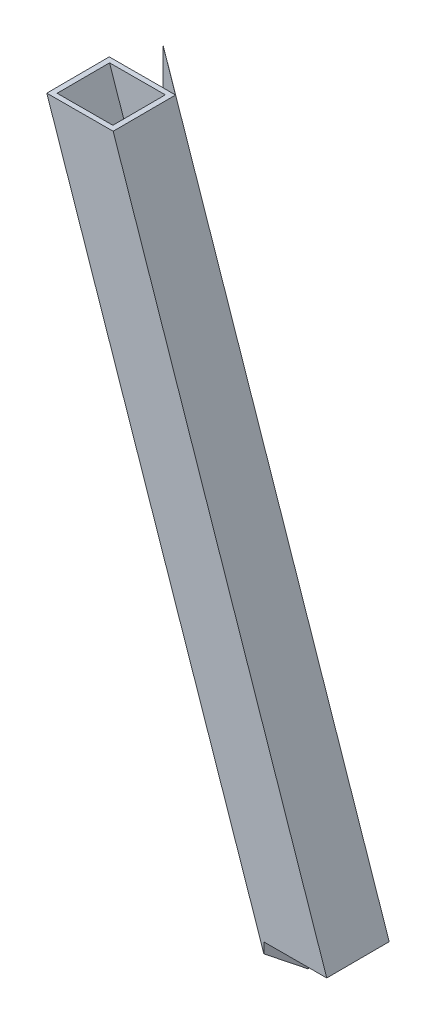
ISO-10303-21;
HEADER;
FILE_DESCRIPTION(('STEP AP214'),'2;1');
FILE_NAME('part.step','',(''),(''),'','','');
FILE_SCHEMA(('AUTOMOTIVE_DESIGN { 1 0 10303 214 1 1 1 1 }'));
ENDSEC;
DATA;
#1=APPLICATION_CONTEXT('core data for automotive mechanical design processes');
#2=APPLICATION_PROTOCOL_DEFINITION('international standard','automotive_design',2000,#1);
#3=PRODUCT_CONTEXT('',#1,'mechanical');
#4=PRODUCT('Part','Part','',(#3));
#5=PRODUCT_RELATED_PRODUCT_CATEGORY('part','',(#4));
#6=PRODUCT_DEFINITION_FORMATION('','',#4);
#7=PRODUCT_DEFINITION_CONTEXT('part definition',#1,'design');
#8=PRODUCT_DEFINITION('design','',#6,#7);
#9=PRODUCT_DEFINITION_SHAPE('','',#8);
#10=(LENGTH_UNIT() NAMED_UNIT(*) SI_UNIT(.MILLI.,.METRE.));
#11=(NAMED_UNIT(*) PLANE_ANGLE_UNIT() SI_UNIT($,.RADIAN.));
#12=(NAMED_UNIT(*) SI_UNIT($,.STERADIAN.) SOLID_ANGLE_UNIT());
#13=UNCERTAINTY_MEASURE_WITH_UNIT(LENGTH_MEASURE(1.E-05),#10,'distance_accuracy_value','');
#14=(GEOMETRIC_REPRESENTATION_CONTEXT(3) GLOBAL_UNCERTAINTY_ASSIGNED_CONTEXT((#13)) GLOBAL_UNIT_ASSIGNED_CONTEXT((#10,
#11,#12)) REPRESENTATION_CONTEXT('',''));
#15=CARTESIAN_POINT('',(0.,0.,0.));
#16=DIRECTION('',(0.,0.,1.));
#17=DIRECTION('',(1.,0.,0.));
#18=AXIS2_PLACEMENT_3D('',#15,#16,#17);
#19=CARTESIAN_POINT('',(-242.073675816652,222.702155971596,-2008.42565950212));
#20=DIRECTION('',(0.00289573675775497,0.000987182985598285,0.99999532007824));
#21=DIRECTION('',(0.99999580734144,0.,-0.00289573816874753));
#22=AXIS2_PLACEMENT_3D('',#19,#20,#21);
#23=PLANE('',#22);
#24=DIRECTION('',(0.000246975568326585,0.999999481525949,-0.00098790227330634));
#25=VECTOR('',#24,1.);
#26=CARTESIAN_POINT('',(-183.158702057765,222.687436880048,-2008.59624802512));
#27=LINE('',#26,#25);
#28=CARTESIAN_POINT('',(-183.212525642923,4.75674188591024,-2008.38095368449));
#29=VERTEX_POINT('',#28);
#30=CARTESIAN_POINT('',(-183.211230685599,10.,-2008.38613351378));
#31=VERTEX_POINT('',#30);
#32=EDGE_CURVE('E264',#29,#31,#27,.T.);
#33=ORIENTED_EDGE('',*,*,#32,.T.);
#34=DIRECTION('',(0.99999580734144,0.,-0.00289573816874753));
#35=VECTOR('',#34,1.);
#36=CARTESIAN_POINT('',(-242.073067780984,10.,-2008.21568433079));
#37=LINE('',#36,#35);
#38=CARTESIAN_POINT('',(-169.561577189971,10.,-2008.42565950212));
#39=VERTEX_POINT('',#38);
#40=EDGE_CURVE('E213',#31,#39,#37,.T.);
#41=ORIENTED_EDGE('',*,*,#40,.T.);
#42=DIRECTION('',(0.322673927788139,-0.94651018817854,0.));
#43=VECTOR('',#42,1.);
#44=CARTESIAN_POINT('',(-242.073675816652,222.702155971596,-2008.42565950212));
#45=LINE('',#44,#43);
#46=CARTESIAN_POINT('',(-237.743395371789,210.,-2008.42565950212));
#47=VERTEX_POINT('',#46);
#48=EDGE_CURVE('E227',#47,#39,#45,.T.);
#49=ORIENTED_EDGE('',*,*,#48,.F.);
#50=DIRECTION('',(-0.99999580734144,0.,0.00289573816874753));
#51=VECTOR('',#50,1.);
#52=CARTESIAN_POINT('',(-242.073639505953,210.,-2008.41312019633));
#53=LINE('',#52,#51);
#54=CARTESIAN_POINT('',(-255.492725053658,210.,-2008.3742618752));
#55=VERTEX_POINT('',#54);
#56=EDGE_CURVE('E194',#47,#55,#53,.T.);
#57=ORIENTED_EDGE('',*,*,#56,.T.);
#58=DIRECTION('',(0.322673927788139,-0.94651018817854,0.));
#59=VECTOR('',#58,1.);
#60=CARTESIAN_POINT('',(-257.974972560878,217.281259354246,-2008.3742618752));
#61=LINE('',#60,#59);
#62=CARTESIAN_POINT('',(-184.999999999999,3.22133984233382,-2008.3742618752));
#63=VERTEX_POINT('',#62);
#64=EDGE_CURVE('E191',#55,#63,#61,.T.);
#65=ORIENTED_EDGE('',*,*,#64,.T.);
#66=DIRECTION('',(0.,0.999999512730672,-0.0009871871245328));
#67=VECTOR('',#66,1.);
#68=CARTESIAN_POINT('',(-184.999999999999,222.701992818159,-2008.59093045547));
#69=LINE('',#68,#67);
#70=CARTESIAN_POINT('',(-184.999999999999,10.,-2008.38095368449));
#71=VERTEX_POINT('',#70);
#72=EDGE_CURVE('E210',#63,#71,#69,.T.);
#73=ORIENTED_EDGE('',*,*,#72,.T.);
#74=DIRECTION('',(-0.322673927788139,0.94651018817854,0.));
#75=VECTOR('',#74,1.);
#76=CARTESIAN_POINT('',(2133.78786446609,-6791.7777357672,-2008.38095368449));
#77=LINE('',#76,#75);
#78=EDGE_CURVE('E260',#29,#71,#77,.T.);
#79=ORIENTED_EDGE('',*,*,#78,.F.);
#80=EDGE_LOOP('',(#33,#41,#49,#57,#65,#73,#79));
#81=FACE_BOUND('',#80,.T.);
#82=ADVANCED_FACE('F41',(#81),#23,.T.);
#83=CARTESIAN_POINT('',(-240.563899781729,223.216852347138,-2010.03054702633));
#84=DIRECTION('',(0.00289573675775387,0.000987182985597912,0.99999532007824));
#85=DIRECTION('',(0.99999580734144,0.,-0.00289573816874643));
#86=AXIS2_PLACEMENT_3D('',#83,#84,#85);
#87=PLANE('',#86);
#88=DIRECTION('',(-0.322673927788139,0.94651018817854,0.));
#89=VECTOR('',#88,1.);
#90=CARTESIAN_POINT('',(2133.78786446609,-6791.7777357672,-2009.9809611724));
#91=LINE('',#90,#89);
#92=CARTESIAN_POINT('',(-182.812523770946,3.58340306144367,-2009.9809611724));
#93=VERTEX_POINT('',#92);
#94=CARTESIAN_POINT('',(-184.999999999999,10.,-2009.9809611724));
#95=VERTEX_POINT('',#94);
#96=EDGE_CURVE('E49',#93,#95,#91,.T.);
#97=ORIENTED_EDGE('',*,*,#96,.T.);
#98=DIRECTION('',(0.,0.999999512730672,-0.000987187124532427));
#99=VECTOR('',#98,1.);
#100=CARTESIAN_POINT('',(-184.999999999999,223.216693509617,-2010.19144604953));
#101=LINE('',#100,#99);
#102=CARTESIAN_POINT('',(-184.999999999999,-1.75237320357124,-2009.96935937523));
#103=VERTEX_POINT('',#102);
#104=EDGE_CURVE('E57',#103,#95,#101,.T.);
#105=ORIENTED_EDGE('',*,*,#104,.F.);
#106=DIRECTION('',(0.322673927788139,-0.94651018817854,0.));
#107=VECTOR('',#106,1.);
#108=CARTESIAN_POINT('',(-259.494014953427,216.76340399315,-2009.96935937523));
#109=LINE('',#108,#107);
#110=CARTESIAN_POINT('',(-257.188309046844,210.,-2009.96935937523));
#111=VERTEX_POINT('',#110);
#112=EDGE_CURVE('E185',#111,#103,#109,.T.);
#113=ORIENTED_EDGE('',*,*,#112,.F.);
#114=DIRECTION('',(-0.99999580734144,0.,0.00289573816874643));
#115=VECTOR('',#114,1.);
#116=CARTESIAN_POINT('',(-240.563861999706,210.,-2010.01749962292));
#117=LINE('',#116,#115);
#118=CARTESIAN_POINT('',(-240.,210.,-2010.01913242648));
#119=VERTEX_POINT('',#118);
#120=EDGE_CURVE('E168',#119,#111,#117,.T.);
#121=ORIENTED_EDGE('',*,*,#120,.F.);
#122=DIRECTION('',(0.,-0.999999512730672,0.000987187124532427));
#123=VECTOR('',#122,1.);
#124=CARTESIAN_POINT('',(-240.,223.216850735148,-2010.03217993771));
#125=LINE('',#124,#123);
#126=CARTESIAN_POINT('',(-240.,221.562746320733,-2010.03054702633));
#127=VERTEX_POINT('',#126);
#128=EDGE_CURVE('E215',#127,#119,#125,.T.);
#129=ORIENTED_EDGE('',*,*,#128,.F.);
#130=DIRECTION('',(0.322673927788139,-0.94651018817854,0.));
#131=VECTOR('',#130,1.);
#132=CARTESIAN_POINT('',(-240.563899781729,223.216852347138,-2010.03054702633));
#133=LINE('',#132,#131);
#134=CARTESIAN_POINT('',(-167.876336481568,10.,-2010.03054702633));
#135=VERTEX_POINT('',#134);
#136=EDGE_CURVE('E193',#127,#135,#133,.T.);
#137=ORIENTED_EDGE('',*,*,#136,.T.);
#138=DIRECTION('',(0.99999580734144,0.,-0.00289573816874643));
#139=VECTOR('',#138,1.);
#140=CARTESIAN_POINT('',(-240.563290274738,10.,-2009.82006375738));
#141=LINE('',#140,#139);
#142=CARTESIAN_POINT('',(-182.810939027448,10.,-2009.98730014638));
#143=VERTEX_POINT('',#142);
#144=EDGE_CURVE('E232',#143,#135,#141,.T.);
#145=ORIENTED_EDGE('',*,*,#144,.F.);
#146=DIRECTION('',(0.000246975568326492,0.999999481525949,-0.000987902273305966));
#147=VECTOR('',#146,1.);
#148=CARTESIAN_POINT('',(-182.758283213667,223.202410413144,-2010.19792340151));
#149=LINE('',#148,#147);
#150=EDGE_CURVE('E266',#93,#143,#149,.T.);
#151=ORIENTED_EDGE('',*,*,#150,.F.);
#152=EDGE_LOOP('',(#97,#105,#113,#121,#129,#137,#145,#151));
#153=FACE_BOUND('',#152,.T.);
#154=ADVANCED_FACE('F273',(#153),#87,.F.);
#155=CARTESIAN_POINT('',(-184.701425001453,-10.,-2002.42535625036));
#156=DIRECTION('',(0.970142500145332,0.,0.242535625036333));
#157=DIRECTION('',(0.242535625036333,0.,-0.970142500145332));
#158=AXIS2_PLACEMENT_3D('',#155,#156,#157);
#159=PLANE('',#158);
#160=ORIENTED_EDGE('',*,*,#150,.T.);
#161=DIRECTION('',(-0.242535625036333,0.,0.970142500145332));
#162=VECTOR('',#161,1.);
#163=CARTESIAN_POINT('',(-184.701425001453,10.,-2002.42535625036));
#164=LINE('',#163,#162);
#165=EDGE_CURVE('E11',#143,#31,#164,.T.);
#166=ORIENTED_EDGE('',*,*,#165,.T.);
#167=ORIENTED_EDGE('',*,*,#32,.F.);
#168=DIRECTION('',(0.197625199539794,-0.579700585316731,-0.790500798159178));
#169=VECTOR('',#168,1.);
#170=CARTESIAN_POINT('',(684.604690935717,-2540.84042674477,-5479.64981999905));
#171=LINE('',#170,#169);
#172=EDGE_CURVE('E44',#29,#93,#171,.T.);
#173=ORIENTED_EDGE('',*,*,#172,.T.);
#174=EDGE_LOOP('',(#160,#166,#167,#173));
#175=FACE_BOUND('',#174,.T.);
#176=ADVANCED_FACE('F269',(#175),#159,.T.);
#177=CARTESIAN_POINT('',(2133.78786446609,-6791.7777357672,-2000.));
#178=DIRECTION('',(0.94651018817854,0.322673927788139,0.));
#179=DIRECTION('',(-0.322673927788139,0.94651018817854,0.));
#180=AXIS2_PLACEMENT_3D('',#177,#178,#179);
#181=PLANE('',#180);
#182=ORIENTED_EDGE('',*,*,#172,.F.);
#183=ORIENTED_EDGE('',*,*,#78,.T.);
#184=DIRECTION('',(0.,0.,-1.));
#185=VECTOR('',#184,1.);
#186=CARTESIAN_POINT('',(-184.999999999999,10.,-2000.));
#187=LINE('',#186,#185);
#188=EDGE_CURVE('E257',#71,#95,#187,.T.);
#189=ORIENTED_EDGE('',*,*,#188,.T.);
#190=ORIENTED_EDGE('',*,*,#96,.F.);
#191=EDGE_LOOP('',(#182,#183,#189,#190));
#192=FACE_BOUND('',#191,.T.);
#193=ADVANCED_FACE('F275',(#192),#181,.F.);
#194=CARTESIAN_POINT('',(-184.701425001453,10.,-2002.42535625036));
#195=DIRECTION('',(0.,-1.,0.));
#196=DIRECTION('',(0.,0.,-1.));
#197=AXIS2_PLACEMENT_3D('',#194,#195,#196);
#198=PLANE('',#197);
#199=ORIENTED_EDGE('',*,*,#40,.F.);
#200=ORIENTED_EDGE('',*,*,#165,.F.);
#201=ORIENTED_EDGE('',*,*,#144,.T.);
#202=DIRECTION('',(0.00323227465392988,0.,0.999994776186637));
#203=VECTOR('',#202,1.);
#204=CARTESIAN_POINT('',(-167.812450434195,10.,-1990.26560732162));
#205=LINE('',#204,#203);
#206=CARTESIAN_POINT('',(-167.811690953355,10.,-1990.03064062477));
#207=VERTEX_POINT('',#206);
#208=EDGE_CURVE('E214',#135,#207,#205,.T.);
#209=ORIENTED_EDGE('',*,*,#208,.T.);
#210=DIRECTION('',(-0.99999580734144,0.,0.00289573816874767));
#211=VECTOR('',#210,1.);
#212=CARTESIAN_POINT('',(-240.505375483142,10.,-1989.82013786528));
#213=LINE('',#212,#211);
#214=CARTESIAN_POINT('',(-187.814584754332,10.,-1989.97271723885));
#215=VERTEX_POINT('',#214);
#216=EDGE_CURVE('E234',#207,#215,#213,.T.);
#217=ORIENTED_EDGE('',*,*,#216,.T.);
#218=DIRECTION('',(-0.242535625036333,0.,0.970142500145332));
#219=VECTOR('',#218,1.);
#220=CARTESIAN_POINT('',(-184.701425001453,10.,-2002.42535625036));
#221=LINE('',#220,#219);
#222=CARTESIAN_POINT('',(-187.258615928232,10.,-1992.19659254325));
#223=VERTEX_POINT('',#222);
#224=EDGE_CURVE('E244',#223,#215,#221,.T.);
#225=ORIENTED_EDGE('',*,*,#224,.F.);
#226=DIRECTION('',(-0.00323227465390977,0.,-0.999994776186637));
#227=VECTOR('',#226,1.);
#228=CARTESIAN_POINT('',(-187.257342957133,10.,-1991.80276324795));
#229=LINE('',#228,#227);
#230=CARTESIAN_POINT('',(-187.256604628211,10.,-1991.57434049788));
#231=VERTEX_POINT('',#230);
#232=EDGE_CURVE('E189',#231,#223,#229,.T.);
#233=ORIENTED_EDGE('',*,*,#232,.F.);
#234=DIRECTION('',(-0.99999580734144,0.,0.00289573816874753));
#235=VECTOR('',#234,1.);
#236=CARTESIAN_POINT('',(-242.024419356045,10.,-1991.41574658143));
#237=LINE('',#236,#235);
#238=CARTESIAN_POINT('',(-169.507274946278,10.,-1991.6257381248));
#239=VERTEX_POINT('',#238);
#240=EDGE_CURVE('E177',#239,#231,#237,.T.);
#241=ORIENTED_EDGE('',*,*,#240,.F.);
#242=DIRECTION('',(0.00323227465390977,0.,0.999994776186637));
#243=VECTOR('',#242,1.);
#244=CARTESIAN_POINT('',(-169.508032582681,10.,-1991.8601341937));
#245=LINE('',#244,#243);
#246=EDGE_CURVE('E236',#39,#239,#245,.T.);
#247=ORIENTED_EDGE('',*,*,#246,.F.);
#248=EDGE_LOOP('',(#199,#200,#201,#209,#217,#225,#233,#241,#247));
#249=FACE_BOUND('',#248,.T.);
#250=ADVANCED_FACE('F301',(#249),#198,.T.);
#251=CARTESIAN_POINT('',(-260.,210.,-2300.));
#252=DIRECTION('',(0.,1.,0.));
#253=DIRECTION('',(0.,0.,1.));
#254=AXIS2_PLACEMENT_3D('',#251,#252,#253);
#255=PLANE('',#254);
#256=ORIENTED_EDGE('',*,*,#120,.T.);
#257=DIRECTION('',(0.00323227465392988,0.,0.999994776186637));
#258=VECTOR('',#257,1.);
#259=CARTESIAN_POINT('',(-257.123687677845,210.,-1989.97692736516));
#260=LINE('',#259,#258);
#261=CARTESIAN_POINT('',(-257.123663518432,210.,-1989.96945297367));
#262=VERTEX_POINT('',#261);
#263=EDGE_CURVE('E162',#111,#262,#260,.T.);
#264=ORIENTED_EDGE('',*,*,#263,.T.);
#265=DIRECTION('',(0.99999580734144,0.,-0.00289573816874767));
#266=VECTOR('',#265,1.);
#267=CARTESIAN_POINT('',(-240.505947208111,210.,-1990.01757373082));
#268=LINE('',#267,#266);
#269=CARTESIAN_POINT('',(-235.99350913515,210.,-1990.03064062477));
#270=VERTEX_POINT('',#269);
#271=EDGE_CURVE('E149',#262,#270,#268,.T.);
#272=ORIENTED_EDGE('',*,*,#271,.T.);
#273=DIRECTION('',(-0.00323227465392988,0.,-0.999994776186637));
#274=VECTOR('',#273,1.);
#275=CARTESIAN_POINT('',(-235.993556279688,210.,-1990.04522611009));
#276=LINE('',#275,#274);
#277=CARTESIAN_POINT('',(-236.058055926491,210.,-2010.));
#278=VERTEX_POINT('',#277);
#279=EDGE_CURVE('E161',#270,#278,#276,.T.);
#280=ORIENTED_EDGE('',*,*,#279,.T.);
#281=DIRECTION('',(1.,0.,0.));
#282=VECTOR('',#281,1.);
#283=CARTESIAN_POINT('',(-250.,210.,-2010.));
#284=LINE('',#283,#282);
#285=CARTESIAN_POINT('',(-240.,210.,-2010.));
#286=VERTEX_POINT('',#285);
#287=EDGE_CURVE('E195',#286,#278,#284,.T.);
#288=ORIENTED_EDGE('',*,*,#287,.F.);
#289=DIRECTION('',(0.,0.,1.));
#290=VECTOR('',#289,1.);
#291=CARTESIAN_POINT('',(-240.,210.,-2300.));
#292=LINE('',#291,#290);
#293=EDGE_CURVE('E176',#119,#286,#292,.T.);
#294=ORIENTED_EDGE('',*,*,#293,.F.);
#295=EDGE_LOOP('',(#256,#264,#272,#280,#288,#294));
#296=FACE_BOUND('',#295,.T.);
#297=DIRECTION('',(-0.00323227465390977,0.,-0.999994776186637));
#298=VECTOR('',#297,1.);
#299=CARTESIAN_POINT('',(-237.689138428174,210.,-1991.63975298217));
#300=LINE('',#299,#298);
#301=CARTESIAN_POINT('',(-237.689093128069,210.,-1991.6257381248));
#302=VERTEX_POINT('',#301);
#303=EDGE_CURVE('E223',#302,#47,#300,.T.);
#304=ORIENTED_EDGE('',*,*,#303,.F.);
#305=DIRECTION('',(0.99999580734144,0.,-0.00289573816874753));
#306=VECTOR('',#305,1.);
#307=CARTESIAN_POINT('',(-242.024991081013,210.,-1991.61318244696));
#308=LINE('',#307,#306);
#309=CARTESIAN_POINT('',(-255.438422810029,210.,-1991.57434049788));
#310=VERTEX_POINT('',#309);
#311=EDGE_CURVE('E208',#310,#302,#308,.T.);
#312=ORIENTED_EDGE('',*,*,#311,.F.);
#313=DIRECTION('',(0.00323227465390977,0.,0.999994776186637));
#314=VECTOR('',#313,1.);
#315=CARTESIAN_POINT('',(-255.438448802626,210.,-1991.58238203642));
#316=LINE('',#315,#314);
#317=EDGE_CURVE('E190',#55,#310,#316,.T.);
#318=ORIENTED_EDGE('',*,*,#317,.F.);
#319=ORIENTED_EDGE('',*,*,#56,.F.);
#320=EDGE_LOOP('',(#304,#312,#318,#319));
#321=FACE_BOUND('',#320,.T.);
#322=ADVANCED_FACE('F165',(#296,#321),#255,.T.);
#323=CARTESIAN_POINT('',(-242.025027439121,222.718740645754,-1991.6257381248));
#324=DIRECTION('',(-0.946505758584915,-0.322672417699403,0.00305938255489713));
#325=DIRECTION('',(0.322673927788139,-0.94651018817854,0.));
#326=AXIS2_PLACEMENT_3D('',#323,#324,#325);
#327=PLANE('',#326);
#328=DIRECTION('',(0.322673927788139,-0.94651018817854,0.));
#329=VECTOR('',#328,1.);
#330=CARTESIAN_POINT('',(-242.025027439121,222.718740645754,-1991.6257381248));
#331=LINE('',#330,#329);
#332=EDGE_CURVE('E181',#302,#239,#331,.T.);
#333=ORIENTED_EDGE('',*,*,#332,.F.);
#334=ORIENTED_EDGE('',*,*,#303,.T.);
#335=ORIENTED_EDGE('',*,*,#48,.T.);
#336=ORIENTED_EDGE('',*,*,#246,.T.);
#337=EDGE_LOOP('',(#333,#334,#335,#336));
#338=FACE_BOUND('',#337,.T.);
#339=ADVANCED_FACE('F312',(#338),#327,.T.);
#340=CARTESIAN_POINT('',(-184.999999999999,-10.,-2000.));
#341=DIRECTION('',(1.,0.,0.));
#342=DIRECTION('',(0.,0.,-1.));
#343=AXIS2_PLACEMENT_3D('',#340,#341,#342);
#344=PLANE('',#343);
#345=DIRECTION('',(0.,-0.00948096236963412,-0.999955054666231));
#346=VECTOR('',#345,1.);
#347=CARTESIAN_POINT('',(-184.999999999999,3.39985515327121,-1989.54629056303));
#348=LINE('',#347,#346);
#349=CARTESIAN_POINT('',(-184.999999999999,3.28906735004171,-2001.23105625618));
#350=VERTEX_POINT('',#349);
#351=EDGE_CURVE('E205',#350,#63,#348,.T.);
#352=ORIENTED_EDGE('',*,*,#351,.F.);
#353=DIRECTION('',(0.,-1.,0.));
#354=VECTOR('',#353,1.);
#355=CARTESIAN_POINT('',(-184.999999999999,-10.,-2001.23105625618));
#356=LINE('',#355,#354);
#357=CARTESIAN_POINT('',(-184.999999999999,-1.66952195674759,-2001.23105625618));
#358=VERTEX_POINT('',#357);
#359=EDGE_CURVE('E202',#350,#358,#356,.T.);
#360=ORIENTED_EDGE('',*,*,#359,.T.);
#361=DIRECTION('',(0.,-0.0094809623696931,-0.999955054666231));
#362=VECTOR('',#361,1.);
#363=CARTESIAN_POINT('',(-184.999999999999,-1.54311950365033,-1987.89941681198));
#364=LINE('',#363,#362);
#365=EDGE_CURVE('E200',#358,#103,#364,.T.);
#366=ORIENTED_EDGE('',*,*,#365,.T.);
#367=ORIENTED_EDGE('',*,*,#104,.T.);
#368=ORIENTED_EDGE('',*,*,#188,.F.);
#369=ORIENTED_EDGE('',*,*,#72,.F.);
#370=EDGE_LOOP('',(#352,#360,#366,#367,#368,#369));
#371=FACE_BOUND('',#370,.T.);
#372=ADVANCED_FACE('F279',(#371),#344,.T.);
#373=CARTESIAN_POINT('',(-184.701425001453,-10.,-2002.42535625036));
#374=DIRECTION('',(0.970142500145332,0.,0.242535625036333));
#375=DIRECTION('',(0.242535625036333,0.,-0.970142500145332));
#376=AXIS2_PLACEMENT_3D('',#373,#374,#375);
#377=PLANE('',#376);
#378=DIRECTION('',(-0.000246975568326597,-0.999999481525949,0.000987902273306389));
#379=VECTOR('',#378,1.);
#380=CARTESIAN_POINT('',(-187.761923752032,223.223418632453,-1990.18336124805));
#381=LINE('',#380,#379);
#382=CARTESIAN_POINT('',(-187.815400820627,6.69576275310485,-1989.96945297367));
#383=VERTEX_POINT('',#382);
#384=EDGE_CURVE('E204',#215,#383,#381,.T.);
#385=ORIENTED_EDGE('',*,*,#384,.T.);
#386=DIRECTION('',(0.196766618222737,-0.584644563135746,-0.78706647289095));
#387=VECTOR('',#386,1.);
#388=CARTESIAN_POINT('',(-214.756491424204,86.7447176449285,-1882.20509055936));
#389=LINE('',#388,#387);
#390=EDGE_CURVE('E175',#383,#358,#389,.T.);
#391=ORIENTED_EDGE('',*,*,#390,.T.);
#392=ORIENTED_EDGE('',*,*,#359,.F.);
#393=DIRECTION('',(0.196766618222743,-0.584644563135716,-0.787066472890971));
#394=VECTOR('',#393,1.);
#395=CARTESIAN_POINT('',(-213.938271969131,89.2721651239908,-1885.47796837965));
#396=LINE('',#395,#394);
#397=EDGE_CURVE('E209',#223,#350,#396,.T.);
#398=ORIENTED_EDGE('',*,*,#397,.F.);
#399=ORIENTED_EDGE('',*,*,#224,.T.);
#400=EDGE_LOOP('',(#385,#391,#392,#398,#399));
#401=FACE_BOUND('',#400,.T.);
#402=ADVANCED_FACE('F303',(#401),#377,.T.);
#403=CARTESIAN_POINT('',(-240.505985046573,223.23659600685,-1990.03064062477));
#404=DIRECTION('',(-0.946505758584915,-0.322672417699403,0.00305938255491617));
#405=DIRECTION('',(0.322673927788139,-0.94651018817854,0.));
#406=AXIS2_PLACEMENT_3D('',#403,#404,#405);
#407=PLANE('',#406);
#408=DIRECTION('',(-0.322673927788139,0.94651018817854,0.));
#409=VECTOR('',#408,1.);
#410=CARTESIAN_POINT('',(-240.563811325168,223.216882502784,-2010.));
#411=LINE('',#410,#409);
#412=CARTESIAN_POINT('',(-240.,221.563035948958,-2010.));
#413=VERTEX_POINT('',#412);
#414=EDGE_CURVE('E197',#278,#413,#411,.T.);
#415=ORIENTED_EDGE('',*,*,#414,.F.);
#416=ORIENTED_EDGE('',*,*,#279,.F.);
#417=DIRECTION('',(0.322673927788139,-0.94651018817854,0.));
#418=VECTOR('',#417,1.);
#419=CARTESIAN_POINT('',(-240.505985046573,223.23659600685,-1990.03064062477));
#420=LINE('',#419,#418);
#421=EDGE_CURVE('E158',#270,#207,#420,.T.);
#422=ORIENTED_EDGE('',*,*,#421,.T.);
#423=ORIENTED_EDGE('',*,*,#208,.F.);
#424=ORIENTED_EDGE('',*,*,#136,.F.);
#425=DIRECTION('',(0.,-0.00948096236969365,-0.999955054666231));
#426=VECTOR('',#425,1.);
#427=CARTESIAN_POINT('',(-240.,221.752506618348,-1990.01656939668));
#428=LINE('',#427,#426);
#429=EDGE_CURVE('E218',#413,#127,#428,.T.);
#430=ORIENTED_EDGE('',*,*,#429,.F.);
#431=EDGE_LOOP('',(#415,#416,#422,#423,#424,#430));
#432=FACE_BOUND('',#431,.T.);
#433=ADVANCED_FACE('F298',(#432),#407,.F.);
#434=CARTESIAN_POINT('',(-250.,210.,-2010.));
#435=DIRECTION('',(0.,0.,1.));
#436=DIRECTION('',(1.,0.,0.));
#437=AXIS2_PLACEMENT_3D('',#434,#435,#436);
#438=PLANE('',#437);
#439=ORIENTED_EDGE('',*,*,#414,.T.);
#440=DIRECTION('',(0.,1.,0.));
#441=VECTOR('',#440,1.);
#442=CARTESIAN_POINT('',(-240.,210.,-2010.));
#443=LINE('',#442,#441);
#444=EDGE_CURVE('E179',#286,#413,#443,.T.);
#445=ORIENTED_EDGE('',*,*,#444,.F.);
#446=ORIENTED_EDGE('',*,*,#287,.T.);
#447=EDGE_LOOP('',(#439,#445,#446));
#448=FACE_BOUND('',#447,.T.);
#449=ADVANCED_FACE('F296',(#448),#438,.T.);
#450=CARTESIAN_POINT('',(-257.926324183348,217.297844028404,-1991.57434049788));
#451=DIRECTION('',(0.946505758584915,0.322672417699403,-0.00305938255489713));
#452=DIRECTION('',(-0.322673927788139,0.94651018817854,0.));
#453=AXIS2_PLACEMENT_3D('',#450,#451,#452);
#454=PLANE('',#453);
#455=ORIENTED_EDGE('',*,*,#64,.F.);
#456=ORIENTED_EDGE('',*,*,#317,.T.);
#457=DIRECTION('',(0.322673927788139,-0.94651018817854,0.));
#458=VECTOR('',#457,1.);
#459=CARTESIAN_POINT('',(-257.926324183348,217.297844028404,-1991.57434049788));
#460=LINE('',#459,#458);
#461=EDGE_CURVE('E186',#310,#231,#460,.T.);
#462=ORIENTED_EDGE('',*,*,#461,.T.);
#463=ORIENTED_EDGE('',*,*,#232,.T.);
#464=ORIENTED_EDGE('',*,*,#397,.T.);
#465=ORIENTED_EDGE('',*,*,#351,.T.);
#466=EDGE_LOOP('',(#455,#456,#462,#463,#464,#465));
#467=FACE_BOUND('',#466,.T.);
#468=ADVANCED_FACE('F285',(#467),#454,.T.);
#469=CARTESIAN_POINT('',(-242.025027439121,222.718740645754,-1991.6257381248));
#470=DIRECTION('',(-0.00289573675775497,-0.000987182985598285,-0.99999532007824));
#471=DIRECTION('',(-0.99999580734144,0.,0.00289573816874753));
#472=AXIS2_PLACEMENT_3D('',#469,#470,#471);
#473=PLANE('',#472);
#474=ORIENTED_EDGE('',*,*,#461,.F.);
#475=ORIENTED_EDGE('',*,*,#311,.T.);
#476=ORIENTED_EDGE('',*,*,#332,.T.);
#477=ORIENTED_EDGE('',*,*,#240,.T.);
#478=EDGE_LOOP('',(#474,#475,#476,#477));
#479=FACE_BOUND('',#478,.T.);
#480=ADVANCED_FACE('F307',(#479),#473,.T.);
#481=CARTESIAN_POINT('',(-240.505985046573,223.23659600685,-1990.03064062477));
#482=DIRECTION('',(-0.00289573675775511,-0.000987182985598334,-0.999995320078241));
#483=DIRECTION('',(-0.99999580734144,0.,0.00289573816874767));
#484=AXIS2_PLACEMENT_3D('',#481,#482,#483);
#485=PLANE('',#484);
#486=ORIENTED_EDGE('',*,*,#271,.F.);
#487=DIRECTION('',(0.322673927788139,-0.94651018817854,0.));
#488=VECTOR('',#487,1.);
#489=CARTESIAN_POINT('',(-259.436100218272,216.783147652862,-1989.96945297367));
#490=LINE('',#489,#488);
#491=EDGE_CURVE('E154',#262,#383,#490,.T.);
#492=ORIENTED_EDGE('',*,*,#491,.T.);
#493=ORIENTED_EDGE('',*,*,#384,.F.);
#494=ORIENTED_EDGE('',*,*,#216,.F.);
#495=ORIENTED_EDGE('',*,*,#421,.F.);
#496=EDGE_LOOP('',(#486,#492,#493,#494,#495));
#497=FACE_BOUND('',#496,.T.);
#498=ADVANCED_FACE('F151',(#497),#485,.F.);
#499=CARTESIAN_POINT('',(-240.,210.,-2300.));
#500=DIRECTION('',(-1.,0.,0.));
#501=DIRECTION('',(0.,0.,1.));
#502=AXIS2_PLACEMENT_3D('',#499,#500,#501);
#503=PLANE('',#502);
#504=ORIENTED_EDGE('',*,*,#293,.T.);
#505=ORIENTED_EDGE('',*,*,#444,.T.);
#506=ORIENTED_EDGE('',*,*,#429,.T.);
#507=ORIENTED_EDGE('',*,*,#128,.T.);
#508=EDGE_LOOP('',(#504,#505,#506,#507));
#509=FACE_BOUND('',#508,.T.);
#510=ADVANCED_FACE('F290',(#509),#503,.T.);
#511=CARTESIAN_POINT('',(-259.436100218272,216.783147652862,-1989.96945297367));
#512=DIRECTION('',(0.946505758584915,0.322672417699403,-0.00305938255491617));
#513=DIRECTION('',(-0.322673927788139,0.94651018817854,0.));
#514=AXIS2_PLACEMENT_3D('',#511,#512,#513);
#515=PLANE('',#514);
#516=ORIENTED_EDGE('',*,*,#491,.F.);
#517=ORIENTED_EDGE('',*,*,#263,.F.);
#518=ORIENTED_EDGE('',*,*,#112,.T.);
#519=ORIENTED_EDGE('',*,*,#365,.F.);
#520=ORIENTED_EDGE('',*,*,#390,.F.);
#521=EDGE_LOOP('',(#516,#517,#518,#519,#520));
#522=FACE_BOUND('',#521,.T.);
#523=ADVANCED_FACE('F173',(#522),#515,.F.);
#524=CLOSED_SHELL('',(#82,#154,#176,#193,#250,#322,#339,#372,#402,#433,#449,#468,#480,#498,#510,#523));
#525=MANIFOLD_SOLID_BREP('B2',#524);
#526=ADVANCED_BREP_SHAPE_REPRESENTATION('',(#18,#525),#14);
#527=SHAPE_DEFINITION_REPRESENTATION(#9,#526);
ENDSEC;
END-ISO-10303-21;
